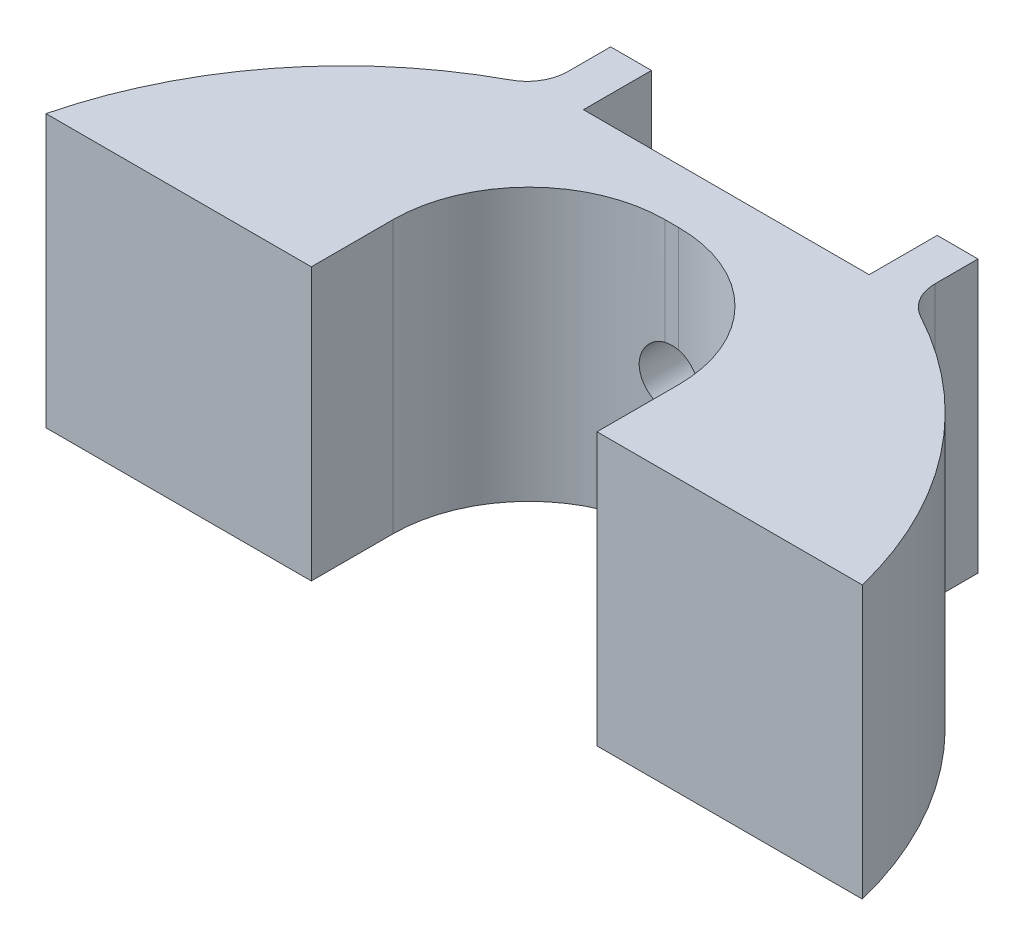
ISO-10303-21;
HEADER;
FILE_DESCRIPTION(('STEP AP214'),'2;1');
FILE_NAME('part.step','',(''),(''),'','','');
FILE_SCHEMA(('AUTOMOTIVE_DESIGN { 1 0 10303 214 1 1 1 1 }'));
ENDSEC;
DATA;
#1=APPLICATION_CONTEXT('core data for automotive mechanical design processes');
#2=APPLICATION_PROTOCOL_DEFINITION('international standard','automotive_design',2000,#1);
#3=PRODUCT_CONTEXT('',#1,'mechanical');
#4=PRODUCT('Part','Part','',(#3));
#5=PRODUCT_RELATED_PRODUCT_CATEGORY('part','',(#4));
#6=PRODUCT_DEFINITION_FORMATION('','',#4);
#7=PRODUCT_DEFINITION_CONTEXT('part definition',#1,'design');
#8=PRODUCT_DEFINITION('design','',#6,#7);
#9=PRODUCT_DEFINITION_SHAPE('','',#8);
#10=(LENGTH_UNIT() NAMED_UNIT(*) SI_UNIT(.MILLI.,.METRE.));
#11=(NAMED_UNIT(*) PLANE_ANGLE_UNIT() SI_UNIT($,.RADIAN.));
#12=(NAMED_UNIT(*) SI_UNIT($,.STERADIAN.) SOLID_ANGLE_UNIT());
#13=UNCERTAINTY_MEASURE_WITH_UNIT(LENGTH_MEASURE(1.E-05),#10,'distance_accuracy_value','');
#14=(GEOMETRIC_REPRESENTATION_CONTEXT(3) GLOBAL_UNCERTAINTY_ASSIGNED_CONTEXT((#13)) GLOBAL_UNIT_ASSIGNED_CONTEXT((#10,
#11,#12)) REPRESENTATION_CONTEXT('',''));
#15=CARTESIAN_POINT('',(0.,0.,0.));
#16=DIRECTION('',(0.,0.,1.));
#17=DIRECTION('',(1.,0.,0.));
#18=AXIS2_PLACEMENT_3D('',#15,#16,#17);
#19=CARTESIAN_POINT('',(0.,20.,4.));
#20=DIRECTION('',(0.,0.,1.));
#21=DIRECTION('',(1.,0.,0.));
#22=AXIS2_PLACEMENT_3D('',#19,#20,#21);
#23=PLANE('',#22);
#24=CARTESIAN_POINT('',(10.5,10.,4.));
#25=DIRECTION('',(0.,0.,1.));
#26=DIRECTION('',(1.,0.,0.));
#27=AXIS2_PLACEMENT_3D('',#24,#25,#26);
#28=CIRCLE('',#27,2.25);
#29=CARTESIAN_POINT('',(10.,12.193741096848,4.));
#30=VERTEX_POINT('',#29);
#31=CARTESIAN_POINT('',(11.,12.193741096848,4.));
#32=VERTEX_POINT('',#31);
#33=EDGE_CURVE('E174',#30,#32,#28,.F.);
#34=ORIENTED_EDGE('',*,*,#33,.T.);
#35=DIRECTION('',(0.,-1.,0.));
#36=VECTOR('',#35,1.);
#37=CARTESIAN_POINT('',(11.,20.,4.));
#38=LINE('',#37,#36);
#39=CARTESIAN_POINT('',(11.,20.,4.));
#40=VERTEX_POINT('',#39);
#41=EDGE_CURVE('E185',#32,#40,#38,.F.);
#42=ORIENTED_EDGE('',*,*,#41,.T.);
#43=DIRECTION('',(-1.,0.,0.));
#44=VECTOR('',#43,1.);
#45=CARTESIAN_POINT('',(0.,20.,4.));
#46=LINE('',#45,#44);
#47=CARTESIAN_POINT('',(10.,20.,4.));
#48=VERTEX_POINT('',#47);
#49=EDGE_CURVE('E268',#40,#48,#46,.T.);
#50=ORIENTED_EDGE('',*,*,#49,.T.);
#51=DIRECTION('',(0.,-1.,0.));
#52=VECTOR('',#51,1.);
#53=CARTESIAN_POINT('',(10.,0.,4.));
#54=LINE('',#53,#52);
#55=EDGE_CURVE('E188',#48,#30,#54,.T.);
#56=ORIENTED_EDGE('',*,*,#55,.T.);
#57=EDGE_LOOP('',(#34,#42,#50,#56));
#58=FACE_BOUND('',#57,.T.);
#59=ADVANCED_FACE('F37',(#58),#23,.T.);
#60=CARTESIAN_POINT('',(0.,20.,0.));
#61=DIRECTION('',(0.,0.,-1.));
#62=DIRECTION('',(-1.,0.,0.));
#63=AXIS2_PLACEMENT_3D('',#60,#61,#62);
#64=PLANE('',#63);
#65=CARTESIAN_POINT('',(10.5,10.,0.));
#66=DIRECTION('',(0.,0.,-1.));
#67=DIRECTION('',(-1.,0.,0.));
#68=AXIS2_PLACEMENT_3D('',#65,#66,#67);
#69=CIRCLE('',#68,2.25);
#70=CARTESIAN_POINT('',(8.25,10.,0.));
#71=VERTEX_POINT('',#70);
#72=EDGE_CURVE('E180',#71,#71,#69,.T.);
#73=ORIENTED_EDGE('',*,*,#72,.F.);
#74=EDGE_LOOP('',(#73));
#75=FACE_BOUND('',#74,.T.);
#76=DIRECTION('',(1.,0.,0.));
#77=VECTOR('',#76,1.);
#78=CARTESIAN_POINT('',(0.,0.,0.));
#79=LINE('',#78,#77);
#80=CARTESIAN_POINT('',(0.,0.,0.));
#81=VERTEX_POINT('',#80);
#82=CARTESIAN_POINT('',(21.,0.,0.));
#83=VERTEX_POINT('',#82);
#84=EDGE_CURVE('E284',#81,#83,#79,.T.);
#85=ORIENTED_EDGE('',*,*,#84,.F.);
#86=DIRECTION('',(0.,-1.,0.));
#87=VECTOR('',#86,1.);
#88=CARTESIAN_POINT('',(0.,20.,0.));
#89=LINE('',#88,#87);
#90=CARTESIAN_POINT('',(0.,20.,0.));
#91=VERTEX_POINT('',#90);
#92=EDGE_CURVE('E195',#91,#81,#89,.T.);
#93=ORIENTED_EDGE('',*,*,#92,.F.);
#94=DIRECTION('',(1.,0.,0.));
#95=VECTOR('',#94,1.);
#96=CARTESIAN_POINT('',(0.,20.,0.));
#97=LINE('',#96,#95);
#98=CARTESIAN_POINT('',(21.,20.,0.));
#99=VERTEX_POINT('',#98);
#100=EDGE_CURVE('E313',#91,#99,#97,.T.);
#101=ORIENTED_EDGE('',*,*,#100,.T.);
#102=DIRECTION('',(0.,-1.,0.));
#103=VECTOR('',#102,1.);
#104=CARTESIAN_POINT('',(21.,20.,0.));
#105=LINE('',#104,#103);
#106=EDGE_CURVE('E283',#99,#83,#105,.T.);
#107=ORIENTED_EDGE('',*,*,#106,.T.);
#108=EDGE_LOOP('',(#85,#93,#101,#107));
#109=FACE_BOUND('',#108,.T.);
#110=ADVANCED_FACE('F343',(#75,#109),#64,.T.);
#111=CARTESIAN_POINT('',(0.,20.,0.));
#112=DIRECTION('',(1.,0.,0.));
#113=DIRECTION('',(0.,0.,-1.));
#114=AXIS2_PLACEMENT_3D('',#111,#112,#113);
#115=PLANE('',#114);
#116=DIRECTION('',(0.,0.,1.));
#117=VECTOR('',#116,1.);
#118=CARTESIAN_POINT('',(0.,0.,0.));
#119=LINE('',#118,#117);
#120=CARTESIAN_POINT('',(0.,0.,-5.));
#121=VERTEX_POINT('',#120);
#122=EDGE_CURVE('E286',#121,#81,#119,.T.);
#123=ORIENTED_EDGE('',*,*,#122,.F.);
#124=DIRECTION('',(0.,-1.,0.));
#125=VECTOR('',#124,1.);
#126=CARTESIAN_POINT('',(0.,20.,-5.));
#127=LINE('',#126,#125);
#128=CARTESIAN_POINT('',(0.,20.,-5.));
#129=VERTEX_POINT('',#128);
#130=EDGE_CURVE('E198',#129,#121,#127,.T.);
#131=ORIENTED_EDGE('',*,*,#130,.F.);
#132=DIRECTION('',(0.,0.,1.));
#133=VECTOR('',#132,1.);
#134=CARTESIAN_POINT('',(0.,20.,0.));
#135=LINE('',#134,#133);
#136=EDGE_CURVE('E449',#129,#91,#135,.T.);
#137=ORIENTED_EDGE('',*,*,#136,.T.);
#138=ORIENTED_EDGE('',*,*,#92,.T.);
#139=EDGE_LOOP('',(#123,#131,#137,#138));
#140=FACE_BOUND('',#139,.T.);
#141=ADVANCED_FACE('F338',(#140),#115,.T.);
#142=CARTESIAN_POINT('',(0.,20.,-5.));
#143=DIRECTION('',(0.,0.,-1.));
#144=DIRECTION('',(-1.,0.,0.));
#145=AXIS2_PLACEMENT_3D('',#142,#143,#144);
#146=PLANE('',#145);
#147=DIRECTION('',(1.,0.,0.));
#148=VECTOR('',#147,1.);
#149=CARTESIAN_POINT('',(0.,0.,-5.));
#150=LINE('',#149,#148);
#151=CARTESIAN_POINT('',(-3.,0.,-5.));
#152=VERTEX_POINT('',#151);
#153=EDGE_CURVE('E242',#152,#121,#150,.T.);
#154=ORIENTED_EDGE('',*,*,#153,.F.);
#155=DIRECTION('',(0.,-1.,0.));
#156=VECTOR('',#155,1.);
#157=CARTESIAN_POINT('',(-3.,20.,-5.));
#158=LINE('',#157,#156);
#159=CARTESIAN_POINT('',(-3.,20.,-5.));
#160=VERTEX_POINT('',#159);
#161=EDGE_CURVE('E240',#160,#152,#158,.T.);
#162=ORIENTED_EDGE('',*,*,#161,.F.);
#163=DIRECTION('',(1.,0.,0.));
#164=VECTOR('',#163,1.);
#165=CARTESIAN_POINT('',(0.,20.,-5.));
#166=LINE('',#165,#164);
#167=EDGE_CURVE('E263',#160,#129,#166,.T.);
#168=ORIENTED_EDGE('',*,*,#167,.T.);
#169=ORIENTED_EDGE('',*,*,#130,.T.);
#170=EDGE_LOOP('',(#154,#162,#168,#169));
#171=FACE_BOUND('',#170,.T.);
#172=ADVANCED_FACE('F334',(#171),#146,.T.);
#173=CARTESIAN_POINT('',(-3.,20.,0.));
#174=DIRECTION('',(-1.,0.,0.));
#175=DIRECTION('',(0.,0.,1.));
#176=AXIS2_PLACEMENT_3D('',#173,#174,#175);
#177=PLANE('',#176);
#178=DIRECTION('',(0.,0.,-1.));
#179=VECTOR('',#178,1.);
#180=CARTESIAN_POINT('',(-3.,0.,0.));
#181=LINE('',#180,#179);
#182=CARTESIAN_POINT('',(-3.,0.,-1.85276760375964));
#183=VERTEX_POINT('',#182);
#184=EDGE_CURVE('E232',#183,#152,#181,.T.);
#185=ORIENTED_EDGE('',*,*,#184,.F.);
#186=DIRECTION('',(0.,-1.,0.));
#187=VECTOR('',#186,1.);
#188=CARTESIAN_POINT('',(-3.,20.,-1.85276760375964));
#189=LINE('',#188,#187);
#190=CARTESIAN_POINT('',(-3.,20.,-1.85276760375964));
#191=VERTEX_POINT('',#190);
#192=EDGE_CURVE('E60',#183,#191,#189,.F.);
#193=ORIENTED_EDGE('',*,*,#192,.T.);
#194=DIRECTION('',(0.,0.,-1.));
#195=VECTOR('',#194,1.);
#196=CARTESIAN_POINT('',(-3.,20.,0.));
#197=LINE('',#196,#195);
#198=EDGE_CURVE('E253',#191,#160,#197,.T.);
#199=ORIENTED_EDGE('',*,*,#198,.T.);
#200=ORIENTED_EDGE('',*,*,#161,.T.);
#201=EDGE_LOOP('',(#185,#193,#199,#200));
#202=FACE_BOUND('',#201,.T.);
#203=ADVANCED_FACE('F238',(#202),#177,.T.);
#204=CARTESIAN_POINT('',(9.61899761275325,20.,27.2169230305214));
#205=DIRECTION('',(0.,-1.,0.));
#206=DIRECTION('',(0.,0.,-1.));
#207=AXIS2_PLACEMENT_3D('',#204,#205,#206);
#208=CYLINDRICAL_SURFACE('',#207,30.);
#209=CARTESIAN_POINT('',(9.61899761275325,20.,27.2169230305214));
#210=DIRECTION('',(0.,1.,0.));
#211=DIRECTION('',(0.,0.,1.));
#212=AXIS2_PLACEMENT_3D('',#209,#210,#211);
#213=CIRCLE('',#212,30.);
#214=CARTESIAN_POINT('',(-4.58009112611334,20.,0.78993154481137));
#215=VERTEX_POINT('',#214);
#216=CARTESIAN_POINT('',(-19.5,20.,20.));
#217=VERTEX_POINT('',#216);
#218=EDGE_CURVE('E250',#215,#217,#213,.T.);
#219=ORIENTED_EDGE('',*,*,#218,.F.);
#220=DIRECTION('',(0.,-1.,0.));
#221=VECTOR('',#220,1.);
#222=CARTESIAN_POINT('',(-4.58009112611334,20.,0.78993154481137));
#223=LINE('',#222,#221);
#224=CARTESIAN_POINT('',(-4.58009112611334,0.,0.78993154481137));
#225=VERTEX_POINT('',#224);
#226=EDGE_CURVE('E220',#215,#225,#223,.T.);
#227=ORIENTED_EDGE('',*,*,#226,.T.);
#228=CARTESIAN_POINT('',(9.61899761275325,0.,27.2169230305214));
#229=DIRECTION('',(0.,1.,0.));
#230=DIRECTION('',(0.,0.,1.));
#231=AXIS2_PLACEMENT_3D('',#228,#229,#230);
#232=CIRCLE('',#231,30.);
#233=CARTESIAN_POINT('',(-19.5,0.,20.));
#234=VERTEX_POINT('',#233);
#235=EDGE_CURVE('E235',#225,#234,#232,.T.);
#236=ORIENTED_EDGE('',*,*,#235,.T.);
#237=DIRECTION('',(0.,-1.,0.));
#238=VECTOR('',#237,1.);
#239=CARTESIAN_POINT('',(-19.5,20.,20.));
#240=LINE('',#239,#238);
#241=EDGE_CURVE('E257',#217,#234,#240,.T.);
#242=ORIENTED_EDGE('',*,*,#241,.F.);
#243=EDGE_LOOP('',(#219,#227,#236,#242));
#244=FACE_BOUND('',#243,.T.);
#245=ADVANCED_FACE('F255',(#244),#208,.T.);
#246=CARTESIAN_POINT('',(0.,20.,20.));
#247=DIRECTION('',(0.,0.,1.));
#248=DIRECTION('',(1.,0.,0.));
#249=AXIS2_PLACEMENT_3D('',#246,#247,#248);
#250=PLANE('',#249);
#251=DIRECTION('',(-1.,0.,0.));
#252=VECTOR('',#251,1.);
#253=CARTESIAN_POINT('',(0.,0.,20.));
#254=LINE('',#253,#252);
#255=CARTESIAN_POINT('',(0.,0.,20.));
#256=VERTEX_POINT('',#255);
#257=EDGE_CURVE('E292',#256,#234,#254,.T.);
#258=ORIENTED_EDGE('',*,*,#257,.F.);
#259=DIRECTION('',(0.,-1.,0.));
#260=VECTOR('',#259,1.);
#261=CARTESIAN_POINT('',(0.,20.,20.));
#262=LINE('',#261,#260);
#263=CARTESIAN_POINT('',(0.,20.,20.));
#264=VERTEX_POINT('',#263);
#265=EDGE_CURVE('E327',#264,#256,#262,.T.);
#266=ORIENTED_EDGE('',*,*,#265,.F.);
#267=DIRECTION('',(-1.,0.,0.));
#268=VECTOR('',#267,1.);
#269=CARTESIAN_POINT('',(0.,20.,20.));
#270=LINE('',#269,#268);
#271=EDGE_CURVE('E259',#264,#217,#270,.T.);
#272=ORIENTED_EDGE('',*,*,#271,.T.);
#273=ORIENTED_EDGE('',*,*,#241,.T.);
#274=EDGE_LOOP('',(#258,#266,#272,#273));
#275=FACE_BOUND('',#274,.T.);
#276=ADVANCED_FACE('F393',(#275),#250,.T.);
#277=CARTESIAN_POINT('',(0.,20.,0.));
#278=DIRECTION('',(1.,0.,0.));
#279=DIRECTION('',(0.,0.,-1.));
#280=AXIS2_PLACEMENT_3D('',#277,#278,#279);
#281=PLANE('',#280);
#282=DIRECTION('',(0.,0.,1.));
#283=VECTOR('',#282,1.);
#284=CARTESIAN_POINT('',(0.,0.,0.));
#285=LINE('',#284,#283);
#286=CARTESIAN_POINT('',(0.,0.,14.));
#287=VERTEX_POINT('',#286);
#288=EDGE_CURVE('E294',#287,#256,#285,.T.);
#289=ORIENTED_EDGE('',*,*,#288,.F.);
#290=DIRECTION('',(0.,-1.,0.));
#291=VECTOR('',#290,1.);
#292=CARTESIAN_POINT('',(0.,20.,14.));
#293=LINE('',#292,#291);
#294=CARTESIAN_POINT('',(0.,20.,14.));
#295=VERTEX_POINT('',#294);
#296=EDGE_CURVE('E203',#287,#295,#293,.F.);
#297=ORIENTED_EDGE('',*,*,#296,.T.);
#298=DIRECTION('',(0.,0.,1.));
#299=VECTOR('',#298,1.);
#300=CARTESIAN_POINT('',(0.,20.,0.));
#301=LINE('',#300,#299);
#302=EDGE_CURVE('E261',#295,#264,#301,.T.);
#303=ORIENTED_EDGE('',*,*,#302,.T.);
#304=ORIENTED_EDGE('',*,*,#265,.T.);
#305=EDGE_LOOP('',(#289,#297,#303,#304));
#306=FACE_BOUND('',#305,.T.);
#307=ADVANCED_FACE('F386',(#306),#281,.T.);
#308=CARTESIAN_POINT('',(11.,7.80625890315197,4.));
#309=VERTEX_POINT('',#308);
#310=CARTESIAN_POINT('',(10.,7.80625890315197,4.));
#311=VERTEX_POINT('',#310);
#312=EDGE_CURVE('E52',#309,#311,#28,.F.);
#313=ORIENTED_EDGE('',*,*,#312,.T.);
#314=CARTESIAN_POINT('',(10.,0.,4.));
#315=VERTEX_POINT('',#314);
#316=EDGE_CURVE('E197',#311,#315,#54,.T.);
#317=ORIENTED_EDGE('',*,*,#316,.T.);
#318=DIRECTION('',(-1.,0.,0.));
#319=VECTOR('',#318,1.);
#320=CARTESIAN_POINT('',(0.,0.,4.));
#321=LINE('',#320,#319);
#322=CARTESIAN_POINT('',(11.,0.,4.));
#323=VERTEX_POINT('',#322);
#324=EDGE_CURVE('E296',#323,#315,#321,.T.);
#325=ORIENTED_EDGE('',*,*,#324,.F.);
#326=EDGE_CURVE('E194',#323,#309,#38,.F.);
#327=ORIENTED_EDGE('',*,*,#326,.T.);
#328=EDGE_LOOP('',(#313,#317,#325,#327));
#329=FACE_BOUND('',#328,.T.);
#330=ADVANCED_FACE('F379',(#329),#23,.T.);
#331=CARTESIAN_POINT('',(21.,20.,0.));
#332=DIRECTION('',(1.,0.,0.));
#333=DIRECTION('',(0.,0.,-1.));
#334=AXIS2_PLACEMENT_3D('',#331,#332,#333);
#335=PLANE('',#334);
#336=DIRECTION('',(0.,0.,1.));
#337=VECTOR('',#336,1.);
#338=CARTESIAN_POINT('',(21.,20.,0.));
#339=LINE('',#338,#337);
#340=CARTESIAN_POINT('',(21.,20.,14.));
#341=VERTEX_POINT('',#340);
#342=CARTESIAN_POINT('',(21.,20.,20.));
#343=VERTEX_POINT('',#342);
#344=EDGE_CURVE('E270',#341,#343,#339,.T.);
#345=ORIENTED_EDGE('',*,*,#344,.F.);
#346=DIRECTION('',(0.,-1.,0.));
#347=VECTOR('',#346,1.);
#348=CARTESIAN_POINT('',(21.,20.,14.));
#349=LINE('',#348,#347);
#350=CARTESIAN_POINT('',(21.,0.,14.));
#351=VERTEX_POINT('',#350);
#352=EDGE_CURVE('E205',#341,#351,#349,.T.);
#353=ORIENTED_EDGE('',*,*,#352,.T.);
#354=DIRECTION('',(0.,0.,1.));
#355=VECTOR('',#354,1.);
#356=CARTESIAN_POINT('',(21.,0.,0.));
#357=LINE('',#356,#355);
#358=CARTESIAN_POINT('',(21.,0.,20.));
#359=VERTEX_POINT('',#358);
#360=EDGE_CURVE('E299',#351,#359,#357,.T.);
#361=ORIENTED_EDGE('',*,*,#360,.T.);
#362=DIRECTION('',(0.,-1.,0.));
#363=VECTOR('',#362,1.);
#364=CARTESIAN_POINT('',(21.,20.,20.));
#365=LINE('',#364,#363);
#366=EDGE_CURVE('E324',#343,#359,#365,.T.);
#367=ORIENTED_EDGE('',*,*,#366,.F.);
#368=EDGE_LOOP('',(#345,#353,#361,#367));
#369=FACE_BOUND('',#368,.T.);
#370=ADVANCED_FACE('F377',(#369),#335,.F.);
#371=CARTESIAN_POINT('',(0.,20.,20.));
#372=DIRECTION('',(0.,0.,1.));
#373=DIRECTION('',(1.,0.,0.));
#374=AXIS2_PLACEMENT_3D('',#371,#372,#373);
#375=PLANE('',#374);
#376=DIRECTION('',(-1.,0.,0.));
#377=VECTOR('',#376,1.);
#378=CARTESIAN_POINT('',(0.,0.,20.));
#379=LINE('',#378,#377);
#380=CARTESIAN_POINT('',(40.5,0.,20.));
#381=VERTEX_POINT('',#380);
#382=EDGE_CURVE('E301',#381,#359,#379,.T.);
#383=ORIENTED_EDGE('',*,*,#382,.F.);
#384=DIRECTION('',(0.,-1.,0.));
#385=VECTOR('',#384,1.);
#386=CARTESIAN_POINT('',(40.5,20.,20.));
#387=LINE('',#386,#385);
#388=CARTESIAN_POINT('',(40.5,20.,20.));
#389=VERTEX_POINT('',#388);
#390=EDGE_CURVE('E321',#389,#381,#387,.T.);
#391=ORIENTED_EDGE('',*,*,#390,.F.);
#392=DIRECTION('',(-1.,0.,0.));
#393=VECTOR('',#392,1.);
#394=CARTESIAN_POINT('',(0.,20.,20.));
#395=LINE('',#394,#393);
#396=EDGE_CURVE('E272',#389,#343,#395,.T.);
#397=ORIENTED_EDGE('',*,*,#396,.T.);
#398=ORIENTED_EDGE('',*,*,#366,.T.);
#399=EDGE_LOOP('',(#383,#391,#397,#398));
#400=FACE_BOUND('',#399,.T.);
#401=ADVANCED_FACE('F373',(#400),#375,.T.);
#402=CARTESIAN_POINT('',(11.3810023872468,20.,27.2169230305214));
#403=DIRECTION('',(0.,-1.,0.));
#404=DIRECTION('',(0.,0.,-1.));
#405=AXIS2_PLACEMENT_3D('',#402,#403,#404);
#406=CYLINDRICAL_SURFACE('',#405,30.);
#407=CARTESIAN_POINT('',(11.3810023872468,0.,27.2169230305214));
#408=DIRECTION('',(0.,1.,0.));
#409=DIRECTION('',(0.,0.,1.));
#410=AXIS2_PLACEMENT_3D('',#407,#408,#409);
#411=CIRCLE('',#410,30.);
#412=CARTESIAN_POINT('',(25.5800911261133,0.,0.78993154481137));
#413=VERTEX_POINT('',#412);
#414=EDGE_CURVE('E304',#413,#381,#411,.F.);
#415=ORIENTED_EDGE('',*,*,#414,.F.);
#416=DIRECTION('',(0.,-1.,0.));
#417=VECTOR('',#416,1.);
#418=CARTESIAN_POINT('',(25.5800911261133,20.,0.78993154481137));
#419=LINE('',#418,#417);
#420=CARTESIAN_POINT('',(25.5800911261133,20.,0.78993154481137));
#421=VERTEX_POINT('',#420);
#422=EDGE_CURVE('E218',#413,#421,#419,.F.);
#423=ORIENTED_EDGE('',*,*,#422,.T.);
#424=CARTESIAN_POINT('',(11.3810023872468,20.,27.2169230305214));
#425=DIRECTION('',(0.,1.,0.));
#426=DIRECTION('',(0.,0.,1.));
#427=AXIS2_PLACEMENT_3D('',#424,#425,#426);
#428=CIRCLE('',#427,30.);
#429=EDGE_CURVE('E275',#421,#389,#428,.F.);
#430=ORIENTED_EDGE('',*,*,#429,.T.);
#431=ORIENTED_EDGE('',*,*,#390,.T.);
#432=EDGE_LOOP('',(#415,#423,#430,#431));
#433=FACE_BOUND('',#432,.T.);
#434=ADVANCED_FACE('F366',(#433),#406,.T.);
#435=CARTESIAN_POINT('',(24.,20.,0.));
#436=DIRECTION('',(-1.,0.,0.));
#437=DIRECTION('',(0.,0.,1.));
#438=AXIS2_PLACEMENT_3D('',#435,#436,#437);
#439=PLANE('',#438);
#440=DIRECTION('',(0.,0.,-1.));
#441=VECTOR('',#440,1.);
#442=CARTESIAN_POINT('',(24.,20.,0.));
#443=LINE('',#442,#441);
#444=CARTESIAN_POINT('',(24.,20.,-1.85276760375964));
#445=VERTEX_POINT('',#444);
#446=CARTESIAN_POINT('',(24.,20.,-5.));
#447=VERTEX_POINT('',#446);
#448=EDGE_CURVE('E277',#445,#447,#443,.T.);
#449=ORIENTED_EDGE('',*,*,#448,.F.);
#450=DIRECTION('',(0.,-1.,0.));
#451=VECTOR('',#450,1.);
#452=CARTESIAN_POINT('',(24.,20.,-1.85276760375964));
#453=LINE('',#452,#451);
#454=CARTESIAN_POINT('',(24.,0.,-1.85276760375964));
#455=VERTEX_POINT('',#454);
#456=EDGE_CURVE('E215',#445,#455,#453,.T.);
#457=ORIENTED_EDGE('',*,*,#456,.T.);
#458=DIRECTION('',(0.,0.,-1.));
#459=VECTOR('',#458,1.);
#460=CARTESIAN_POINT('',(24.,0.,0.));
#461=LINE('',#460,#459);
#462=CARTESIAN_POINT('',(24.,0.,-5.));
#463=VERTEX_POINT('',#462);
#464=EDGE_CURVE('E306',#455,#463,#461,.T.);
#465=ORIENTED_EDGE('',*,*,#464,.T.);
#466=DIRECTION('',(0.,-1.,0.));
#467=VECTOR('',#466,1.);
#468=CARTESIAN_POINT('',(24.,20.,-5.));
#469=LINE('',#468,#467);
#470=EDGE_CURVE('E318',#447,#463,#469,.T.);
#471=ORIENTED_EDGE('',*,*,#470,.F.);
#472=EDGE_LOOP('',(#449,#457,#465,#471));
#473=FACE_BOUND('',#472,.T.);
#474=ADVANCED_FACE('F358',(#473),#439,.F.);
#475=CARTESIAN_POINT('',(0.,20.,-5.00000000000001));
#476=DIRECTION('',(0.,0.,1.));
#477=DIRECTION('',(1.,0.,0.));
#478=AXIS2_PLACEMENT_3D('',#475,#476,#477);
#479=PLANE('',#478);
#480=DIRECTION('',(-1.,0.,0.));
#481=VECTOR('',#480,1.);
#482=CARTESIAN_POINT('',(0.,0.,-5.00000000000001));
#483=LINE('',#482,#481);
#484=CARTESIAN_POINT('',(21.,0.,-5.));
#485=VERTEX_POINT('',#484);
#486=EDGE_CURVE('E308',#463,#485,#483,.T.);
#487=ORIENTED_EDGE('',*,*,#486,.T.);
#488=DIRECTION('',(0.,-1.,0.));
#489=VECTOR('',#488,1.);
#490=CARTESIAN_POINT('',(21.,20.,-5.));
#491=LINE('',#490,#489);
#492=CARTESIAN_POINT('',(21.,20.,-5.));
#493=VERTEX_POINT('',#492);
#494=EDGE_CURVE('E315',#493,#485,#491,.T.);
#495=ORIENTED_EDGE('',*,*,#494,.F.);
#496=DIRECTION('',(-1.,0.,0.));
#497=VECTOR('',#496,1.);
#498=CARTESIAN_POINT('',(0.,20.,-5.00000000000001));
#499=LINE('',#498,#497);
#500=EDGE_CURVE('E279',#447,#493,#499,.T.);
#501=ORIENTED_EDGE('',*,*,#500,.F.);
#502=ORIENTED_EDGE('',*,*,#470,.T.);
#503=EDGE_LOOP('',(#487,#495,#501,#502));
#504=FACE_BOUND('',#503,.T.);
#505=ADVANCED_FACE('F352',(#504),#479,.F.);
#506=CARTESIAN_POINT('',(21.,20.,0.));
#507=DIRECTION('',(1.,0.,0.));
#508=DIRECTION('',(0.,0.,-1.));
#509=AXIS2_PLACEMENT_3D('',#506,#507,#508);
#510=PLANE('',#509);
#511=DIRECTION('',(0.,0.,1.));
#512=VECTOR('',#511,1.);
#513=CARTESIAN_POINT('',(21.,0.,0.));
#514=LINE('',#513,#512);
#515=EDGE_CURVE('E310',#485,#83,#514,.T.);
#516=ORIENTED_EDGE('',*,*,#515,.T.);
#517=ORIENTED_EDGE('',*,*,#106,.F.);
#518=DIRECTION('',(0.,0.,1.));
#519=VECTOR('',#518,1.);
#520=CARTESIAN_POINT('',(21.,20.,0.));
#521=LINE('',#520,#519);
#522=EDGE_CURVE('E281',#493,#99,#521,.T.);
#523=ORIENTED_EDGE('',*,*,#522,.F.);
#524=ORIENTED_EDGE('',*,*,#494,.T.);
#525=EDGE_LOOP('',(#516,#517,#523,#524));
#526=FACE_BOUND('',#525,.T.);
#527=ADVANCED_FACE('F348',(#526),#510,.F.);
#528=CARTESIAN_POINT('',(0.,20.,0.));
#529=DIRECTION('',(0.,1.,0.));
#530=DIRECTION('',(0.,0.,1.));
#531=AXIS2_PLACEMENT_3D('',#528,#529,#530);
#532=PLANE('',#531);
#533=ORIENTED_EDGE('',*,*,#100,.F.);
#534=ORIENTED_EDGE('',*,*,#136,.F.);
#535=ORIENTED_EDGE('',*,*,#167,.F.);
#536=ORIENTED_EDGE('',*,*,#198,.F.);
#537=CARTESIAN_POINT('',(-6.,20.,-1.85276760375964));
#538=DIRECTION('',(0.,1.,0.));
#539=DIRECTION('',(0.,0.,1.));
#540=AXIS2_PLACEMENT_3D('',#537,#538,#539);
#541=CIRCLE('',#540,3.);
#542=EDGE_CURVE('E11',#191,#215,#541,.F.);
#543=ORIENTED_EDGE('',*,*,#542,.T.);
#544=ORIENTED_EDGE('',*,*,#218,.T.);
#545=ORIENTED_EDGE('',*,*,#271,.F.);
#546=ORIENTED_EDGE('',*,*,#302,.F.);
#547=CARTESIAN_POINT('',(10.,20.,14.));
#548=DIRECTION('',(0.,1.,0.));
#549=DIRECTION('',(0.,0.,1.));
#550=AXIS2_PLACEMENT_3D('',#547,#548,#549);
#551=CIRCLE('',#550,10.);
#552=EDGE_CURVE('E210',#295,#48,#551,.F.);
#553=ORIENTED_EDGE('',*,*,#552,.T.);
#554=ORIENTED_EDGE('',*,*,#49,.F.);
#555=CARTESIAN_POINT('',(11.,20.,14.));
#556=DIRECTION('',(0.,1.,0.));
#557=DIRECTION('',(0.,0.,1.));
#558=AXIS2_PLACEMENT_3D('',#555,#556,#557);
#559=CIRCLE('',#558,10.);
#560=EDGE_CURVE('E193',#40,#341,#559,.F.);
#561=ORIENTED_EDGE('',*,*,#560,.T.);
#562=ORIENTED_EDGE('',*,*,#344,.T.);
#563=ORIENTED_EDGE('',*,*,#396,.F.);
#564=ORIENTED_EDGE('',*,*,#429,.F.);
#565=CARTESIAN_POINT('',(27.,20.,-1.85276760375964));
#566=DIRECTION('',(0.,1.,0.));
#567=DIRECTION('',(0.,0.,1.));
#568=AXIS2_PLACEMENT_3D('',#565,#566,#567);
#569=CIRCLE('',#568,3.);
#570=EDGE_CURVE('E226',#421,#445,#569,.F.);
#571=ORIENTED_EDGE('',*,*,#570,.T.);
#572=ORIENTED_EDGE('',*,*,#448,.T.);
#573=ORIENTED_EDGE('',*,*,#500,.T.);
#574=ORIENTED_EDGE('',*,*,#522,.T.);
#575=EDGE_LOOP('',(#533,#534,#535,#536,#543,#544,#545,#546,#553,#554,#561,#562,#563,#564,#571,
#572,#573,#574));
#576=FACE_BOUND('',#575,.T.);
#577=ADVANCED_FACE('F248',(#576),#532,.T.);
#578=CARTESIAN_POINT('',(0.,0.,0.));
#579=DIRECTION('',(0.,1.,0.));
#580=DIRECTION('',(0.,0.,1.));
#581=AXIS2_PLACEMENT_3D('',#578,#579,#580);
#582=PLANE('',#581);
#583=ORIENTED_EDGE('',*,*,#84,.T.);
#584=ORIENTED_EDGE('',*,*,#515,.F.);
#585=ORIENTED_EDGE('',*,*,#486,.F.);
#586=ORIENTED_EDGE('',*,*,#464,.F.);
#587=CARTESIAN_POINT('',(27.,0.,-1.85276760375964));
#588=DIRECTION('',(0.,1.,0.));
#589=DIRECTION('',(0.,0.,1.));
#590=AXIS2_PLACEMENT_3D('',#587,#588,#589);
#591=CIRCLE('',#590,3.);
#592=EDGE_CURVE('E224',#455,#413,#591,.T.);
#593=ORIENTED_EDGE('',*,*,#592,.T.);
#594=ORIENTED_EDGE('',*,*,#414,.T.);
#595=ORIENTED_EDGE('',*,*,#382,.T.);
#596=ORIENTED_EDGE('',*,*,#360,.F.);
#597=CARTESIAN_POINT('',(11.,0.,14.));
#598=DIRECTION('',(0.,1.,0.));
#599=DIRECTION('',(0.,0.,1.));
#600=AXIS2_PLACEMENT_3D('',#597,#598,#599);
#601=CIRCLE('',#600,10.);
#602=EDGE_CURVE('E212',#351,#323,#601,.T.);
#603=ORIENTED_EDGE('',*,*,#602,.T.);
#604=ORIENTED_EDGE('',*,*,#324,.T.);
#605=CARTESIAN_POINT('',(10.,0.,14.));
#606=DIRECTION('',(0.,1.,0.));
#607=DIRECTION('',(0.,0.,1.));
#608=AXIS2_PLACEMENT_3D('',#605,#606,#607);
#609=CIRCLE('',#608,10.);
#610=EDGE_CURVE('E208',#315,#287,#609,.T.);
#611=ORIENTED_EDGE('',*,*,#610,.T.);
#612=ORIENTED_EDGE('',*,*,#288,.T.);
#613=ORIENTED_EDGE('',*,*,#257,.T.);
#614=ORIENTED_EDGE('',*,*,#235,.F.);
#615=CARTESIAN_POINT('',(-6.,0.,-1.85276760375964));
#616=DIRECTION('',(0.,1.,0.));
#617=DIRECTION('',(0.,0.,1.));
#618=AXIS2_PLACEMENT_3D('',#615,#616,#617);
#619=CIRCLE('',#618,3.);
#620=EDGE_CURVE('E45',#225,#183,#619,.T.);
#621=ORIENTED_EDGE('',*,*,#620,.T.);
#622=ORIENTED_EDGE('',*,*,#184,.T.);
#623=ORIENTED_EDGE('',*,*,#153,.T.);
#624=ORIENTED_EDGE('',*,*,#122,.T.);
#625=EDGE_LOOP('',(#583,#584,#585,#586,#593,#594,#595,#596,#603,#604,#611,#612,#613,#614,#621,
#622,#623,#624));
#626=FACE_BOUND('',#625,.T.);
#627=ADVANCED_FACE('F230',(#626),#582,.F.);
#628=CARTESIAN_POINT('',(10.,20.,14.));
#629=DIRECTION('',(0.,1.,0.));
#630=DIRECTION('',(0.,0.,1.));
#631=AXIS2_PLACEMENT_3D('',#628,#629,#630);
#632=CYLINDRICAL_SURFACE('',#631,10.);
#633=ORIENTED_EDGE('',*,*,#316,.F.);
#634=CARTESIAN_POINT('',(10.,12.193741096848,4.));
#635=CARTESIAN_POINT('',(9.9387738788429,12.1797867346279,3.99999707288168));
#636=CARTESIAN_POINT('',(9.87816343854816,12.1632739822091,4.00056286038208));
#637=CARTESIAN_POINT('',(9.75855888466078,12.1252542006364,4.00273667845957));
#638=CARTESIAN_POINT('',(9.69956452554658,12.1037479348745,4.00434454979354));
#639=CARTESIAN_POINT('',(9.52582196108576,12.0320251852413,4.01057925439847));
#640=CARTESIAN_POINT('',(9.41402905910749,11.9745393728901,4.01661804996465));
#641=CARTESIAN_POINT('',(9.20173562501692,11.841927836316,4.03134213975489));
#642=CARTESIAN_POINT('',(9.10123518671232,11.7668019655712,4.04002745596165));
#643=CARTESIAN_POINT('',(8.91413270815602,11.6009823499209,4.05868526384853));
#644=CARTESIAN_POINT('',(8.82753199004949,11.5102871257504,4.06865787781417));
#645=CARTESIAN_POINT('',(8.66960995825283,11.3146000949197,4.08856754341376));
#646=CARTESIAN_POINT('',(8.59848655115764,11.2094483369596,4.09850269912624));
#647=CARTESIAN_POINT('',(8.47484988214017,10.9885765113362,4.11679006597585));
#648=CARTESIAN_POINT('',(8.4223380557997,10.8728556293017,4.12514215498195));
#649=CARTESIAN_POINT('',(8.33749040753222,10.634109978144,4.13907084766479));
#650=CARTESIAN_POINT('',(8.30514872698503,10.5110873412691,4.14464825717957));
#651=CARTESIAN_POINT('',(8.26162664158631,10.2612593222496,4.15223095746648));
#652=CARTESIAN_POINT('',(8.25044268618914,10.134454578421,4.15423684758339));
#653=CARTESIAN_POINT('',(8.24958914904551,9.88256458133316,4.1543888245402));
#654=CARTESIAN_POINT('',(8.25961863866022,9.75748027575754,4.15258889983575));
#655=CARTESIAN_POINT('',(8.30027017491658,9.51080075337183,4.14549152187298));
#656=CARTESIAN_POINT('',(8.33089380381652,9.38920580539938,4.14019379987767));
#657=CARTESIAN_POINT('',(8.41176855947206,9.15303006604936,4.12684515658937));
#658=CARTESIAN_POINT('',(8.46200108361157,9.03844274547863,4.1187968456304));
#659=CARTESIAN_POINT('',(8.58065752297956,8.81925729977371,4.10105826400787));
#660=CARTESIAN_POINT('',(8.64908114303156,8.71465901259064,4.09136801998794));
#661=CARTESIAN_POINT('',(8.80331912273583,8.51685052694013,4.07155214083671));
#662=CARTESIAN_POINT('',(8.88936408227582,8.42382076329463,4.06142230379759));
#663=CARTESIAN_POINT('',(9.07597033413621,8.25340858653916,4.04234348067612));
#664=CARTESIAN_POINT('',(9.17653228965417,8.17602688868672,4.03339454857824));
#665=CARTESIAN_POINT('',(9.33753284968483,8.07245846681799,4.02181565459884));
#666=CARTESIAN_POINT('',(9.3937531307126,8.03965404773951,4.01822697043263));
#667=CARTESIAN_POINT('',(9.50887705154943,7.97900951238233,4.01190123520028));
#668=CARTESIAN_POINT('',(9.56778072530983,7.95116945893663,4.00916419491289));
#669=CARTESIAN_POINT('',(9.68791172662397,7.9006512793026,4.0046904473337));
#670=CARTESIAN_POINT('',(9.74914279851825,7.87798192066956,4.00295543158068));
#671=CARTESIAN_POINT('',(9.87336907408073,7.83803319820933,4.00060731765615));
#672=CARTESIAN_POINT('',(9.93636453849839,7.82075463568628,3.99999438620878));
#673=CARTESIAN_POINT('',(10.,7.80625890315197,4.));
#674=B_SPLINE_CURVE_WITH_KNOTS('',3,(#634,#635,#636,#637,#638,#639,#640,#641,#642,#643,#644,
#645,#646,#647,#648,#649,#650,#651,#652,#653,#654,#655,#656,#657,#658,#659,#660,#661,#662,#663,
#664,#665,#666,#667,#668,#669,#670,#671,#672,#673),.UNSPECIFIED.,.F.,.F.,(4,2,2,2,2,2,2,2,2,2,2,
2,2,2,2,2,2,2,2,4),(0.,0.188268869083169,0.376508975167432,0.752122741479204,1.12773962782338,
1.50339222180078,1.88359770474431,2.26383250799958,2.6439568167608,3.02401732998366,
3.39872258541564,3.77345663293461,4.14783603741717,4.52220936743087,4.90183700355881,
5.28148198816835,5.476844141756,5.67220876782897,5.86790223624844,6.06362477929031),.UNSPECIFIED.);
#675=EDGE_CURVE('E287',#30,#311,#674,.T.);
#676=ORIENTED_EDGE('',*,*,#675,.F.);
#677=ORIENTED_EDGE('',*,*,#55,.F.);
#678=ORIENTED_EDGE('',*,*,#552,.F.);
#679=ORIENTED_EDGE('',*,*,#296,.F.);
#680=ORIENTED_EDGE('',*,*,#610,.F.);
#681=EDGE_LOOP('',(#633,#676,#677,#678,#679,#680));
#682=FACE_BOUND('',#681,.T.);
#683=ADVANCED_FACE('F391',(#682),#632,.F.);
#684=CARTESIAN_POINT('',(11.,20.,14.));
#685=DIRECTION('',(0.,-1.,0.));
#686=DIRECTION('',(0.,0.,-1.));
#687=AXIS2_PLACEMENT_3D('',#684,#685,#686);
#688=CYLINDRICAL_SURFACE('',#687,10.);
#689=ORIENTED_EDGE('',*,*,#41,.F.);
#690=CARTESIAN_POINT('',(11.,7.80625890315197,4.));
#691=CARTESIAN_POINT('',(11.0612261211571,7.82021326537208,3.99999707288168));
#692=CARTESIAN_POINT('',(11.1218365614518,7.83672601779088,4.00056286038208));
#693=CARTESIAN_POINT('',(11.2414411153392,7.87474579936358,4.00273667845957));
#694=CARTESIAN_POINT('',(11.3004354744534,7.89625206512553,4.00434454979354));
#695=CARTESIAN_POINT('',(11.4741780389142,7.96797481475872,4.01057925439847));
#696=CARTESIAN_POINT('',(11.5859709408925,8.0254606271099,4.01661804996465));
#697=CARTESIAN_POINT('',(11.7982643749831,8.15807216368403,4.03134213975489));
#698=CARTESIAN_POINT('',(11.8987648132877,8.23319803442878,4.04002745596165));
#699=CARTESIAN_POINT('',(12.085867291844,8.39901765007907,4.05868526384853));
#700=CARTESIAN_POINT('',(12.1724680099505,8.48971287424963,4.06865787781417));
#701=CARTESIAN_POINT('',(12.3303900417472,8.68539990508033,4.08856754341376));
#702=CARTESIAN_POINT('',(12.4015134488424,8.79055166304035,4.09850269912624));
#703=CARTESIAN_POINT('',(12.5251501178598,9.01142348866378,4.11679006597585));
#704=CARTESIAN_POINT('',(12.5776619442003,9.12714437069834,4.12514215498195));
#705=CARTESIAN_POINT('',(12.6625095924678,9.36589002185603,4.13907084766479));
#706=CARTESIAN_POINT('',(12.694851273015,9.48891265873086,4.14464825717957));
#707=CARTESIAN_POINT('',(12.7383733584137,9.73874067775039,4.15223095746648));
#708=CARTESIAN_POINT('',(12.7495573138109,9.86554542157905,4.15423684758339));
#709=CARTESIAN_POINT('',(12.7504108509545,10.1174354186668,4.1543888245402));
#710=CARTESIAN_POINT('',(12.7403813613398,10.2425197242425,4.15258889983575));
#711=CARTESIAN_POINT('',(12.6997298250834,10.4891992466282,4.14549152187298));
#712=CARTESIAN_POINT('',(12.6691061961835,10.6107941946006,4.14019379987767));
#713=CARTESIAN_POINT('',(12.5882314405279,10.8469699339506,4.12684515658937));
#714=CARTESIAN_POINT('',(12.5379989163884,10.9615572545214,4.1187968456304));
#715=CARTESIAN_POINT('',(12.4193424770204,11.1807427002263,4.10105826400787));
#716=CARTESIAN_POINT('',(12.3509188569684,11.2853409874094,4.09136801998794));
#717=CARTESIAN_POINT('',(12.1966808772642,11.4831494730599,4.07155214083671));
#718=CARTESIAN_POINT('',(12.1106359177242,11.5761792367054,4.06142230379759));
#719=CARTESIAN_POINT('',(11.9240296658638,11.7465914134608,4.04234348067612));
#720=CARTESIAN_POINT('',(11.8234677103458,11.8239731113133,4.03339454857824));
#721=CARTESIAN_POINT('',(11.6624671503152,11.927541533182,4.02181565459884));
#722=CARTESIAN_POINT('',(11.6062468692874,11.9603459522605,4.01822697043264));
#723=CARTESIAN_POINT('',(11.4911229484506,12.0209904876177,4.01190123520028));
#724=CARTESIAN_POINT('',(11.4322192746902,12.0488305410634,4.00916419491289));
#725=CARTESIAN_POINT('',(11.312088273376,12.0993487206974,4.00469044733369));
#726=CARTESIAN_POINT('',(11.2508572014817,12.1220180793304,4.00295543158068));
#727=CARTESIAN_POINT('',(11.1266309259193,12.1619668017907,4.00060731765615));
#728=CARTESIAN_POINT('',(11.0636354615016,12.1792453643137,3.99999438620878));
#729=CARTESIAN_POINT('',(11.,12.193741096848,4.));
#730=B_SPLINE_CURVE_WITH_KNOTS('',3,(#690,#691,#692,#693,#694,#695,#696,#697,#698,#699,#700,
#701,#702,#703,#704,#705,#706,#707,#708,#709,#710,#711,#712,#713,#714,#715,#716,#717,#718,#719,
#720,#721,#722,#723,#724,#725,#726,#727,#728,#729),.UNSPECIFIED.,.F.,.F.,(4,2,2,2,2,2,2,2,2,2,2,
2,2,2,2,2,2,2,2,4),(0.,0.188268869083168,0.37650897516743,0.752122741479203,1.12773962782338,
1.50339222180078,1.8835977047443,2.26383250799958,2.6439568167608,3.02401732998366,
3.39872258541564,3.77345663293461,4.14783603741717,4.52220936743087,4.90183700355881,
5.28148198816835,5.47684414175599,5.67220876782897,5.86790223624843,6.06362477929031),.UNSPECIFIED.);
#731=EDGE_CURVE('E171',#309,#32,#730,.T.);
#732=ORIENTED_EDGE('',*,*,#731,.F.);
#733=ORIENTED_EDGE('',*,*,#326,.F.);
#734=ORIENTED_EDGE('',*,*,#602,.F.);
#735=ORIENTED_EDGE('',*,*,#352,.F.);
#736=ORIENTED_EDGE('',*,*,#560,.F.);
#737=EDGE_LOOP('',(#689,#732,#733,#734,#735,#736));
#738=FACE_BOUND('',#737,.T.);
#739=ADVANCED_FACE('F191',(#738),#688,.F.);
#740=CARTESIAN_POINT('',(27.,20.,-1.85276760375964));
#741=DIRECTION('',(0.,-1.,0.));
#742=DIRECTION('',(0.,0.,-1.));
#743=AXIS2_PLACEMENT_3D('',#740,#741,#742);
#744=CYLINDRICAL_SURFACE('',#743,3.);
#745=ORIENTED_EDGE('',*,*,#570,.F.);
#746=ORIENTED_EDGE('',*,*,#422,.F.);
#747=ORIENTED_EDGE('',*,*,#592,.F.);
#748=ORIENTED_EDGE('',*,*,#456,.F.);
#749=EDGE_LOOP('',(#745,#746,#747,#748));
#750=FACE_BOUND('',#749,.T.);
#751=ADVANCED_FACE('F362',(#750),#744,.F.);
#752=CARTESIAN_POINT('',(-6.,20.,-1.85276760375964));
#753=DIRECTION('',(0.,-1.,0.));
#754=DIRECTION('',(0.,0.,-1.));
#755=AXIS2_PLACEMENT_3D('',#752,#753,#754);
#756=CYLINDRICAL_SURFACE('',#755,3.);
#757=ORIENTED_EDGE('',*,*,#542,.F.);
#758=ORIENTED_EDGE('',*,*,#192,.F.);
#759=ORIENTED_EDGE('',*,*,#620,.F.);
#760=ORIENTED_EDGE('',*,*,#226,.F.);
#761=EDGE_LOOP('',(#757,#758,#759,#760));
#762=FACE_BOUND('',#761,.T.);
#763=ADVANCED_FACE('F39',(#762),#756,.F.);
#764=CARTESIAN_POINT('',(10.5,10.,20.001));
#765=DIRECTION('',(0.,0.,-1.));
#766=DIRECTION('',(-1.,0.,0.));
#767=AXIS2_PLACEMENT_3D('',#764,#765,#766);
#768=CYLINDRICAL_SURFACE('',#767,2.25);
#769=ORIENTED_EDGE('',*,*,#72,.T.);
#770=EDGE_LOOP('',(#769));
#771=FACE_BOUND('',#770,.T.);
#772=ORIENTED_EDGE('',*,*,#675,.T.);
#773=ORIENTED_EDGE('',*,*,#312,.F.);
#774=ORIENTED_EDGE('',*,*,#731,.T.);
#775=ORIENTED_EDGE('',*,*,#33,.F.);
#776=EDGE_LOOP('',(#772,#773,#774,#775));
#777=FACE_BOUND('',#776,.T.);
#778=ADVANCED_FACE('F173',(#771,#777),#768,.F.);
#779=CLOSED_SHELL('',(#59,#110,#141,#172,#203,#245,#276,#307,#330,#370,#401,#434,#474,#505,#527,
#577,#627,#683,#739,#751,#763,#778));
#780=MANIFOLD_SOLID_BREP('B2',#779);
#781=ADVANCED_BREP_SHAPE_REPRESENTATION('',(#18,#780),#14);
#782=SHAPE_DEFINITION_REPRESENTATION(#9,#781);
ENDSEC;
END-ISO-10303-21;
